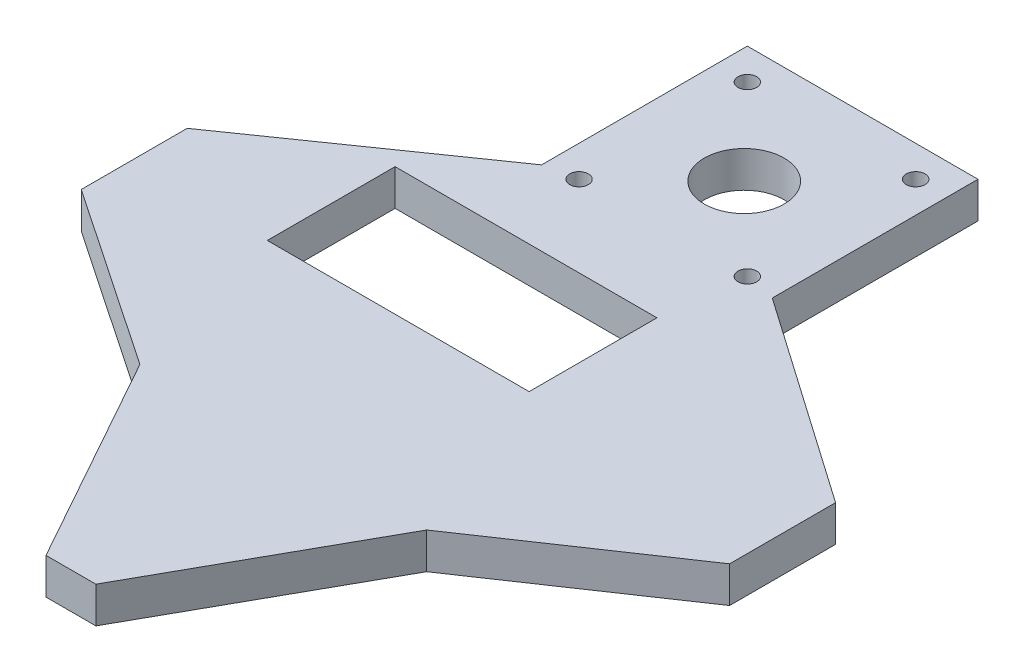
ISO-10303-21;
HEADER;
FILE_DESCRIPTION(('STEP AP214'),'2;1');
FILE_NAME('part.step','',(''),(''),'','','');
FILE_SCHEMA(('AUTOMOTIVE_DESIGN { 1 0 10303 214 1 1 1 1 }'));
ENDSEC;
DATA;
#1=APPLICATION_CONTEXT('core data for automotive mechanical design processes');
#2=APPLICATION_PROTOCOL_DEFINITION('international standard','automotive_design',2000,#1);
#3=PRODUCT_CONTEXT('',#1,'mechanical');
#4=PRODUCT('Part','Part','',(#3));
#5=PRODUCT_RELATED_PRODUCT_CATEGORY('part','',(#4));
#6=PRODUCT_DEFINITION_FORMATION('','',#4);
#7=PRODUCT_DEFINITION_CONTEXT('part definition',#1,'design');
#8=PRODUCT_DEFINITION('design','',#6,#7);
#9=PRODUCT_DEFINITION_SHAPE('','',#8);
#10=(LENGTH_UNIT() NAMED_UNIT(*) SI_UNIT(.MILLI.,.METRE.));
#11=(NAMED_UNIT(*) PLANE_ANGLE_UNIT() SI_UNIT($,.RADIAN.));
#12=(NAMED_UNIT(*) SI_UNIT($,.STERADIAN.) SOLID_ANGLE_UNIT());
#13=UNCERTAINTY_MEASURE_WITH_UNIT(LENGTH_MEASURE(1.E-05),#10,'distance_accuracy_value','');
#14=(GEOMETRIC_REPRESENTATION_CONTEXT(3) GLOBAL_UNCERTAINTY_ASSIGNED_CONTEXT((#13)) GLOBAL_UNIT_ASSIGNED_CONTEXT((#10,
#11,#12)) REPRESENTATION_CONTEXT('',''));
#15=CARTESIAN_POINT('',(0.,0.,0.));
#16=DIRECTION('',(0.,0.,1.));
#17=DIRECTION('',(1.,0.,0.));
#18=AXIS2_PLACEMENT_3D('',#15,#16,#17);
#19=CARTESIAN_POINT('',(0.,5.8,0.));
#20=DIRECTION('',(0.,0.,1.));
#21=DIRECTION('',(1.,0.,0.));
#22=AXIS2_PLACEMENT_3D('',#19,#20,#21);
#23=PLANE('',#22);
#24=DIRECTION('',(-1.,0.,0.));
#25=VECTOR('',#24,1.);
#26=CARTESIAN_POINT('',(0.,0.,0.));
#27=LINE('',#26,#25);
#28=CARTESIAN_POINT('',(18.5,0.,0.));
#29=VERTEX_POINT('',#28);
#30=CARTESIAN_POINT('',(-18.5,0.,0.));
#31=VERTEX_POINT('',#30);
#32=EDGE_CURVE('E276',#29,#31,#27,.T.);
#33=ORIENTED_EDGE('',*,*,#32,.T.);
#34=DIRECTION('',(0.,-1.,0.));
#35=VECTOR('',#34,1.);
#36=CARTESIAN_POINT('',(-18.5,5.8,0.));
#37=LINE('',#36,#35);
#38=CARTESIAN_POINT('',(-18.5,5.8,0.));
#39=VERTEX_POINT('',#38);
#40=EDGE_CURVE('E11',#39,#31,#37,.T.);
#41=ORIENTED_EDGE('',*,*,#40,.F.);
#42=DIRECTION('',(-1.,0.,0.));
#43=VECTOR('',#42,1.);
#44=CARTESIAN_POINT('',(0.,5.8,0.));
#45=LINE('',#44,#43);
#46=CARTESIAN_POINT('',(18.5,5.8,0.));
#47=VERTEX_POINT('',#46);
#48=EDGE_CURVE('E291',#47,#39,#45,.T.);
#49=ORIENTED_EDGE('',*,*,#48,.F.);
#50=DIRECTION('',(0.,-1.,0.));
#51=VECTOR('',#50,1.);
#52=CARTESIAN_POINT('',(18.5,5.8,0.));
#53=LINE('',#52,#51);
#54=EDGE_CURVE('E228',#47,#29,#53,.T.);
#55=ORIENTED_EDGE('',*,*,#54,.T.);
#56=EDGE_LOOP('',(#33,#41,#49,#55));
#57=FACE_BOUND('',#56,.T.);
#58=ADVANCED_FACE('F38',(#57),#23,.F.);
#59=CARTESIAN_POINT('',(-18.5,5.8,0.));
#60=DIRECTION('',(1.,0.,0.));
#61=DIRECTION('',(0.,0.,-1.));
#62=AXIS2_PLACEMENT_3D('',#59,#60,#61);
#63=PLANE('',#62);
#64=DIRECTION('',(0.,0.,1.));
#65=VECTOR('',#64,1.);
#66=CARTESIAN_POINT('',(-18.5,0.,0.));
#67=LINE('',#66,#65);
#68=CARTESIAN_POINT('',(-18.5,0.,33.));
#69=VERTEX_POINT('',#68);
#70=EDGE_CURVE('E316',#31,#69,#67,.T.);
#71=ORIENTED_EDGE('',*,*,#70,.T.);
#72=DIRECTION('',(0.,-1.,0.));
#73=VECTOR('',#72,1.);
#74=CARTESIAN_POINT('',(-18.5,5.8,33.));
#75=LINE('',#74,#73);
#76=CARTESIAN_POINT('',(-18.5,5.8,33.));
#77=VERTEX_POINT('',#76);
#78=EDGE_CURVE('E46',#77,#69,#75,.T.);
#79=ORIENTED_EDGE('',*,*,#78,.F.);
#80=DIRECTION('',(0.,0.,1.));
#81=VECTOR('',#80,1.);
#82=CARTESIAN_POINT('',(-18.5,5.8,0.));
#83=LINE('',#82,#81);
#84=EDGE_CURVE('E294',#39,#77,#83,.T.);
#85=ORIENTED_EDGE('',*,*,#84,.F.);
#86=ORIENTED_EDGE('',*,*,#40,.T.);
#87=EDGE_LOOP('',(#71,#79,#85,#86));
#88=FACE_BOUND('',#87,.T.);
#89=ADVANCED_FACE('F378',(#88),#63,.F.);
#90=CARTESIAN_POINT('',(-18.5,5.8,33.));
#91=DIRECTION('',(0.571740316904142,0.,0.820434647017269));
#92=DIRECTION('',(0.820434647017269,0.,-0.571740316904142));
#93=AXIS2_PLACEMENT_3D('',#90,#91,#92);
#94=PLANE('',#93);
#95=DIRECTION('',(-0.820434647017269,0.,0.571740316904142));
#96=VECTOR('',#95,1.);
#97=CARTESIAN_POINT('',(-18.5,0.,33.));
#98=LINE('',#97,#96);
#99=CARTESIAN_POINT('',(-52.,0.,56.3453093258818));
#100=VERTEX_POINT('',#99);
#101=EDGE_CURVE('E319',#69,#100,#98,.T.);
#102=ORIENTED_EDGE('',*,*,#101,.T.);
#103=DIRECTION('',(0.,-1.,0.));
#104=VECTOR('',#103,1.);
#105=CARTESIAN_POINT('',(-52.,5.8,56.3453093258818));
#106=LINE('',#105,#104);
#107=CARTESIAN_POINT('',(-52.,5.8,56.3453093258818));
#108=VERTEX_POINT('',#107);
#109=EDGE_CURVE('E344',#108,#100,#106,.T.);
#110=ORIENTED_EDGE('',*,*,#109,.F.);
#111=DIRECTION('',(-0.820434647017269,0.,0.571740316904142));
#112=VECTOR('',#111,1.);
#113=CARTESIAN_POINT('',(-18.5,5.8,33.));
#114=LINE('',#113,#112);
#115=EDGE_CURVE('E298',#77,#108,#114,.T.);
#116=ORIENTED_EDGE('',*,*,#115,.F.);
#117=ORIENTED_EDGE('',*,*,#78,.T.);
#118=EDGE_LOOP('',(#102,#110,#116,#117));
#119=FACE_BOUND('',#118,.T.);
#120=ADVANCED_FACE('F353',(#119),#94,.F.);
#121=CARTESIAN_POINT('',(-52.,5.8,56.3453093258818));
#122=DIRECTION('',(1.,0.,0.));
#123=DIRECTION('',(0.,0.,-1.));
#124=AXIS2_PLACEMENT_3D('',#121,#122,#123);
#125=PLANE('',#124);
#126=DIRECTION('',(0.,0.,1.));
#127=VECTOR('',#126,1.);
#128=CARTESIAN_POINT('',(-52.,0.,56.3453093258818));
#129=LINE('',#128,#127);
#130=CARTESIAN_POINT('',(-52.,0.,73.3453093258818));
#131=VERTEX_POINT('',#130);
#132=EDGE_CURVE('E322',#100,#131,#129,.T.);
#133=ORIENTED_EDGE('',*,*,#132,.T.);
#134=DIRECTION('',(0.,-1.,0.));
#135=VECTOR('',#134,1.);
#136=CARTESIAN_POINT('',(-52.,5.8,73.3453093258818));
#137=LINE('',#136,#135);
#138=CARTESIAN_POINT('',(-52.,5.8,73.3453093258818));
#139=VERTEX_POINT('',#138);
#140=EDGE_CURVE('E340',#139,#131,#137,.T.);
#141=ORIENTED_EDGE('',*,*,#140,.F.);
#142=DIRECTION('',(0.,0.,1.));
#143=VECTOR('',#142,1.);
#144=CARTESIAN_POINT('',(-52.,5.8,56.3453093258818));
#145=LINE('',#144,#143);
#146=EDGE_CURVE('E301',#108,#139,#145,.T.);
#147=ORIENTED_EDGE('',*,*,#146,.F.);
#148=ORIENTED_EDGE('',*,*,#109,.T.);
#149=EDGE_LOOP('',(#133,#141,#147,#148));
#150=FACE_BOUND('',#149,.T.);
#151=ADVANCED_FACE('F366',(#150),#125,.F.);
#152=CARTESIAN_POINT('',(-52.,5.8,73.3453093258818));
#153=DIRECTION('',(0.559883369779012,0.,-0.828571428571428));
#154=DIRECTION('',(-0.828571428571428,0.,-0.559883369779012));
#155=AXIS2_PLACEMENT_3D('',#152,#153,#154);
#156=PLANE('',#155);
#157=DIRECTION('',(0.828571428571429,0.,0.559883369779012));
#158=VECTOR('',#157,1.);
#159=CARTESIAN_POINT('',(-52.,0.,73.3453093258818));
#160=LINE('',#159,#158);
#161=CARTESIAN_POINT('',(-23.,0.,92.9412272681472));
#162=VERTEX_POINT('',#161);
#163=EDGE_CURVE('E325',#131,#162,#160,.T.);
#164=ORIENTED_EDGE('',*,*,#163,.T.);
#165=DIRECTION('',(0.,-1.,0.));
#166=VECTOR('',#165,1.);
#167=CARTESIAN_POINT('',(-23.,5.8,92.9412272681472));
#168=LINE('',#167,#166);
#169=CARTESIAN_POINT('',(-23.,5.8,92.9412272681472));
#170=VERTEX_POINT('',#169);
#171=EDGE_CURVE('E336',#170,#162,#168,.T.);
#172=ORIENTED_EDGE('',*,*,#171,.F.);
#173=DIRECTION('',(0.828571428571429,0.,0.559883369779012));
#174=VECTOR('',#173,1.);
#175=CARTESIAN_POINT('',(-52.,5.8,73.3453093258818));
#176=LINE('',#175,#174);
#177=EDGE_CURVE('E304',#139,#170,#176,.T.);
#178=ORIENTED_EDGE('',*,*,#177,.F.);
#179=ORIENTED_EDGE('',*,*,#140,.T.);
#180=EDGE_LOOP('',(#164,#172,#178,#179));
#181=FACE_BOUND('',#180,.T.);
#182=ADVANCED_FACE('F370',(#181),#156,.F.);
#183=CARTESIAN_POINT('',(-23.,5.8,92.9412272681472));
#184=DIRECTION('',(0.873301864919303,0.,-0.487179487179487));
#185=DIRECTION('',(-0.487179487179487,0.,-0.873301864919303));
#186=AXIS2_PLACEMENT_3D('',#183,#184,#185);
#187=PLANE('',#186);
#188=DIRECTION('',(0.487179487179487,0.,0.873301864919303));
#189=VECTOR('',#188,1.);
#190=CARTESIAN_POINT('',(-23.,0.,92.9412272681472));
#191=LINE('',#190,#189);
#192=CARTESIAN_POINT('',(-3.99999999999999,0.,127.));
#193=VERTEX_POINT('',#192);
#194=EDGE_CURVE('E328',#162,#193,#191,.T.);
#195=ORIENTED_EDGE('',*,*,#194,.T.);
#196=DIRECTION('',(0.,-1.,0.));
#197=VECTOR('',#196,1.);
#198=CARTESIAN_POINT('',(-3.99999999999999,5.8,127.));
#199=LINE('',#198,#197);
#200=CARTESIAN_POINT('',(-3.99999999999999,5.8,127.));
#201=VERTEX_POINT('',#200);
#202=EDGE_CURVE('E313',#201,#193,#199,.T.);
#203=ORIENTED_EDGE('',*,*,#202,.F.);
#204=DIRECTION('',(0.487179487179487,0.,0.873301864919303));
#205=VECTOR('',#204,1.);
#206=CARTESIAN_POINT('',(-23.,5.8,92.9412272681472));
#207=LINE('',#206,#205);
#208=EDGE_CURVE('E307',#170,#201,#207,.T.);
#209=ORIENTED_EDGE('',*,*,#208,.F.);
#210=ORIENTED_EDGE('',*,*,#171,.T.);
#211=EDGE_LOOP('',(#195,#203,#209,#210));
#212=FACE_BOUND('',#211,.T.);
#213=ADVANCED_FACE('F406',(#212),#187,.F.);
#214=CARTESIAN_POINT('',(-3.99999999999999,5.8,127.));
#215=DIRECTION('',(0.,0.,-1.));
#216=DIRECTION('',(-1.,0.,0.));
#217=AXIS2_PLACEMENT_3D('',#214,#215,#216);
#218=PLANE('',#217);
#219=DIRECTION('',(1.,0.,0.));
#220=VECTOR('',#219,1.);
#221=CARTESIAN_POINT('',(-3.99999999999999,0.,127.));
#222=LINE('',#221,#220);
#223=CARTESIAN_POINT('',(3.99999999999999,0.,127.));
#224=VERTEX_POINT('',#223);
#225=EDGE_CURVE('E295',#193,#224,#222,.T.);
#226=ORIENTED_EDGE('',*,*,#225,.T.);
#227=DIRECTION('',(0.,-1.,0.));
#228=VECTOR('',#227,1.);
#229=CARTESIAN_POINT('',(3.99999999999999,5.8,127.));
#230=LINE('',#229,#228);
#231=CARTESIAN_POINT('',(3.99999999999999,5.8,127.));
#232=VERTEX_POINT('',#231);
#233=EDGE_CURVE('E262',#232,#224,#230,.T.);
#234=ORIENTED_EDGE('',*,*,#233,.F.);
#235=DIRECTION('',(1.,0.,0.));
#236=VECTOR('',#235,1.);
#237=CARTESIAN_POINT('',(-3.99999999999999,5.8,127.));
#238=LINE('',#237,#236);
#239=EDGE_CURVE('E310',#201,#232,#238,.T.);
#240=ORIENTED_EDGE('',*,*,#239,.F.);
#241=ORIENTED_EDGE('',*,*,#202,.T.);
#242=EDGE_LOOP('',(#226,#234,#240,#241));
#243=FACE_BOUND('',#242,.T.);
#244=ADVANCED_FACE('F404',(#243),#218,.F.);
#245=CARTESIAN_POINT('',(0.,5.8,0.));
#246=DIRECTION('',(0.,1.,0.));
#247=DIRECTION('',(0.,0.,1.));
#248=AXIS2_PLACEMENT_3D('',#245,#246,#247);
#249=PLANE('',#248);
#250=DIRECTION('',(0.,0.,1.));
#251=VECTOR('',#250,1.);
#252=CARTESIAN_POINT('',(-30.,5.8,45.));
#253=LINE('',#252,#251);
#254=CARTESIAN_POINT('',(-30.,5.8,45.));
#255=VERTEX_POINT('',#254);
#256=CARTESIAN_POINT('',(-30.,5.8,65.5));
#257=VERTEX_POINT('',#256);
#258=EDGE_CURVE('E53',#255,#257,#253,.T.);
#259=ORIENTED_EDGE('',*,*,#258,.F.);
#260=DIRECTION('',(-1.,0.,0.));
#261=VECTOR('',#260,1.);
#262=CARTESIAN_POINT('',(-30.,5.8,45.));
#263=LINE('',#262,#261);
#264=CARTESIAN_POINT('',(12.,5.8,45.));
#265=VERTEX_POINT('',#264);
#266=EDGE_CURVE('E172',#265,#255,#263,.T.);
#267=ORIENTED_EDGE('',*,*,#266,.F.);
#268=DIRECTION('',(0.,0.,-1.));
#269=VECTOR('',#268,1.);
#270=CARTESIAN_POINT('',(12.,5.8,45.));
#271=LINE('',#270,#269);
#272=CARTESIAN_POINT('',(12.,5.8,65.5));
#273=VERTEX_POINT('',#272);
#274=EDGE_CURVE('E154',#273,#265,#271,.T.);
#275=ORIENTED_EDGE('',*,*,#274,.F.);
#276=DIRECTION('',(1.,0.,0.));
#277=VECTOR('',#276,1.);
#278=CARTESIAN_POINT('',(-30.,5.8,65.5));
#279=LINE('',#278,#277);
#280=EDGE_CURVE('E164',#257,#273,#279,.T.);
#281=ORIENTED_EDGE('',*,*,#280,.F.);
#282=EDGE_LOOP('',(#259,#267,#275,#281));
#283=FACE_BOUND('',#282,.T.);
#284=CARTESIAN_POINT('',(13.5,5.8,5.));
#285=DIRECTION('',(0.,-1.,0.));
#286=DIRECTION('',(0.,0.,1.));
#287=AXIS2_PLACEMENT_3D('',#284,#285,#286);
#288=CIRCLE('',#287,1.5);
#289=CARTESIAN_POINT('',(13.5,5.8,6.5));
#290=VERTEX_POINT('',#289);
#291=EDGE_CURVE('E191',#290,#290,#288,.T.);
#292=ORIENTED_EDGE('',*,*,#291,.T.);
#293=EDGE_LOOP('',(#292));
#294=FACE_BOUND('',#293,.T.);
#295=CARTESIAN_POINT('',(13.5,5.8,32.));
#296=DIRECTION('',(0.,-1.,0.));
#297=DIRECTION('',(0.,0.,1.));
#298=AXIS2_PLACEMENT_3D('',#295,#296,#297);
#299=CIRCLE('',#298,1.5);
#300=CARTESIAN_POINT('',(13.5,5.8,33.5));
#301=VERTEX_POINT('',#300);
#302=EDGE_CURVE('E189',#301,#301,#299,.T.);
#303=ORIENTED_EDGE('',*,*,#302,.T.);
#304=EDGE_LOOP('',(#303));
#305=FACE_BOUND('',#304,.T.);
#306=DIRECTION('',(0.,0.,1.));
#307=VECTOR('',#306,1.);
#308=CARTESIAN_POINT('',(18.5,5.8,0.));
#309=LINE('',#308,#307);
#310=CARTESIAN_POINT('',(18.5,5.8,33.));
#311=VERTEX_POINT('',#310);
#312=EDGE_CURVE('E224',#47,#311,#309,.T.);
#313=ORIENTED_EDGE('',*,*,#312,.F.);
#314=ORIENTED_EDGE('',*,*,#48,.T.);
#315=ORIENTED_EDGE('',*,*,#84,.T.);
#316=ORIENTED_EDGE('',*,*,#115,.T.);
#317=ORIENTED_EDGE('',*,*,#146,.T.);
#318=ORIENTED_EDGE('',*,*,#177,.T.);
#319=ORIENTED_EDGE('',*,*,#208,.T.);
#320=ORIENTED_EDGE('',*,*,#239,.T.);
#321=DIRECTION('',(-0.487179487179487,0.,0.873301864919303));
#322=VECTOR('',#321,1.);
#323=CARTESIAN_POINT('',(23.,5.8,92.9412272681472));
#324=LINE('',#323,#322);
#325=CARTESIAN_POINT('',(23.,5.8,92.9412272681472));
#326=VERTEX_POINT('',#325);
#327=EDGE_CURVE('E207',#326,#232,#324,.T.);
#328=ORIENTED_EDGE('',*,*,#327,.F.);
#329=DIRECTION('',(-0.828571428571429,0.,0.559883369779012));
#330=VECTOR('',#329,1.);
#331=CARTESIAN_POINT('',(52.,5.8,73.3453093258818));
#332=LINE('',#331,#330);
#333=CARTESIAN_POINT('',(52.,5.8,73.3453093258818));
#334=VERTEX_POINT('',#333);
#335=EDGE_CURVE('E211',#334,#326,#332,.T.);
#336=ORIENTED_EDGE('',*,*,#335,.F.);
#337=DIRECTION('',(0.,0.,1.));
#338=VECTOR('',#337,1.);
#339=CARTESIAN_POINT('',(52.,5.8,56.3453093258818));
#340=LINE('',#339,#338);
#341=CARTESIAN_POINT('',(52.,5.8,56.3453093258818));
#342=VERTEX_POINT('',#341);
#343=EDGE_CURVE('E216',#342,#334,#340,.T.);
#344=ORIENTED_EDGE('',*,*,#343,.F.);
#345=DIRECTION('',(0.820434647017269,0.,0.571740316904142));
#346=VECTOR('',#345,1.);
#347=CARTESIAN_POINT('',(18.5,5.8,33.));
#348=LINE('',#347,#346);
#349=EDGE_CURVE('E220',#311,#342,#348,.T.);
#350=ORIENTED_EDGE('',*,*,#349,.F.);
#351=EDGE_LOOP('',(#313,#314,#315,#316,#317,#318,#319,#320,#328,#336,#344,#350));
#352=FACE_BOUND('',#351,.T.);
#353=CARTESIAN_POINT('',(-13.5,5.8,5.));
#354=DIRECTION('',(0.,1.,0.));
#355=DIRECTION('',(0.,0.,1.));
#356=AXIS2_PLACEMENT_3D('',#353,#354,#355);
#357=CIRCLE('',#356,1.5);
#358=CARTESIAN_POINT('',(-13.5,5.8,6.5));
#359=VERTEX_POINT('',#358);
#360=EDGE_CURVE('E267',#359,#359,#357,.T.);
#361=ORIENTED_EDGE('',*,*,#360,.F.);
#362=EDGE_LOOP('',(#361));
#363=FACE_BOUND('',#362,.T.);
#364=CARTESIAN_POINT('',(0.,5.8,19.));
#365=DIRECTION('',(0.,1.,0.));
#366=DIRECTION('',(0.,0.,1.));
#367=AXIS2_PLACEMENT_3D('',#364,#365,#366);
#368=CIRCLE('',#367,6.4);
#369=CARTESIAN_POINT('',(0.,5.8,25.4));
#370=VERTEX_POINT('',#369);
#371=EDGE_CURVE('E277',#370,#370,#368,.T.);
#372=ORIENTED_EDGE('',*,*,#371,.F.);
#373=EDGE_LOOP('',(#372));
#374=FACE_BOUND('',#373,.T.);
#375=CARTESIAN_POINT('',(-13.5,5.8,32.));
#376=DIRECTION('',(0.,1.,0.));
#377=DIRECTION('',(0.,0.,1.));
#378=AXIS2_PLACEMENT_3D('',#375,#376,#377);
#379=CIRCLE('',#378,1.5);
#380=CARTESIAN_POINT('',(-13.5,5.8,33.5));
#381=VERTEX_POINT('',#380);
#382=EDGE_CURVE('E266',#381,#381,#379,.T.);
#383=ORIENTED_EDGE('',*,*,#382,.F.);
#384=EDGE_LOOP('',(#383));
#385=FACE_BOUND('',#384,.T.);
#386=ADVANCED_FACE('F169',(#283,#294,#305,#352,#363,#374,#385),#249,.T.);
#387=CARTESIAN_POINT('',(0.,0.,0.));
#388=DIRECTION('',(0.,1.,0.));
#389=DIRECTION('',(0.,0.,1.));
#390=AXIS2_PLACEMENT_3D('',#387,#388,#389);
#391=PLANE('',#390);
#392=DIRECTION('',(1.,0.,0.));
#393=VECTOR('',#392,1.);
#394=CARTESIAN_POINT('',(-30.,0.,45.));
#395=LINE('',#394,#393);
#396=CARTESIAN_POINT('',(-30.,0.,45.));
#397=VERTEX_POINT('',#396);
#398=CARTESIAN_POINT('',(12.,0.,45.));
#399=VERTEX_POINT('',#398);
#400=EDGE_CURVE('E595',#397,#399,#395,.T.);
#401=ORIENTED_EDGE('',*,*,#400,.F.);
#402=DIRECTION('',(0.,0.,-1.));
#403=VECTOR('',#402,1.);
#404=CARTESIAN_POINT('',(-30.,0.,45.));
#405=LINE('',#404,#403);
#406=CARTESIAN_POINT('',(-30.,0.,65.5));
#407=VERTEX_POINT('',#406);
#408=EDGE_CURVE('E190',#407,#397,#405,.T.);
#409=ORIENTED_EDGE('',*,*,#408,.F.);
#410=DIRECTION('',(-1.,0.,0.));
#411=VECTOR('',#410,1.);
#412=CARTESIAN_POINT('',(-30.,0.,65.5));
#413=LINE('',#412,#411);
#414=CARTESIAN_POINT('',(12.,0.,65.5));
#415=VERTEX_POINT('',#414);
#416=EDGE_CURVE('E186',#415,#407,#413,.T.);
#417=ORIENTED_EDGE('',*,*,#416,.F.);
#418=DIRECTION('',(0.,0.,1.));
#419=VECTOR('',#418,1.);
#420=CARTESIAN_POINT('',(12.,0.,45.));
#421=LINE('',#420,#419);
#422=EDGE_CURVE('E157',#399,#415,#421,.T.);
#423=ORIENTED_EDGE('',*,*,#422,.F.);
#424=EDGE_LOOP('',(#401,#409,#417,#423));
#425=FACE_BOUND('',#424,.T.);
#426=CARTESIAN_POINT('',(13.5,0.,5.));
#427=DIRECTION('',(0.,1.,0.));
#428=DIRECTION('',(0.,0.,1.));
#429=AXIS2_PLACEMENT_3D('',#426,#427,#428);
#430=CIRCLE('',#429,1.5);
#431=CARTESIAN_POINT('',(13.5,0.,6.5));
#432=VERTEX_POINT('',#431);
#433=EDGE_CURVE('E195',#432,#432,#430,.T.);
#434=ORIENTED_EDGE('',*,*,#433,.T.);
#435=EDGE_LOOP('',(#434));
#436=FACE_BOUND('',#435,.T.);
#437=CARTESIAN_POINT('',(0.,0.,19.));
#438=DIRECTION('',(0.,1.,0.));
#439=DIRECTION('',(0.,0.,1.));
#440=AXIS2_PLACEMENT_3D('',#437,#438,#439);
#441=CIRCLE('',#440,6.4);
#442=CARTESIAN_POINT('',(0.,0.,25.4));
#443=VERTEX_POINT('',#442);
#444=EDGE_CURVE('E272',#443,#443,#441,.F.);
#445=ORIENTED_EDGE('',*,*,#444,.F.);
#446=EDGE_LOOP('',(#445));
#447=FACE_BOUND('',#446,.T.);
#448=CARTESIAN_POINT('',(13.5,0.,32.));
#449=DIRECTION('',(0.,1.,0.));
#450=DIRECTION('',(0.,0.,1.));
#451=AXIS2_PLACEMENT_3D('',#448,#449,#450);
#452=CIRCLE('',#451,1.5);
#453=CARTESIAN_POINT('',(13.5,0.,33.5));
#454=VERTEX_POINT('',#453);
#455=EDGE_CURVE('E196',#454,#454,#452,.T.);
#456=ORIENTED_EDGE('',*,*,#455,.T.);
#457=EDGE_LOOP('',(#456));
#458=FACE_BOUND('',#457,.T.);
#459=ORIENTED_EDGE('',*,*,#32,.F.);
#460=DIRECTION('',(0.,0.,1.));
#461=VECTOR('',#460,1.);
#462=CARTESIAN_POINT('',(18.5,0.,0.));
#463=LINE('',#462,#461);
#464=CARTESIAN_POINT('',(18.5,0.,33.));
#465=VERTEX_POINT('',#464);
#466=EDGE_CURVE('E212',#29,#465,#463,.T.);
#467=ORIENTED_EDGE('',*,*,#466,.T.);
#468=DIRECTION('',(0.820434647017269,0.,0.571740316904142));
#469=VECTOR('',#468,1.);
#470=CARTESIAN_POINT('',(18.5,0.,33.));
#471=LINE('',#470,#469);
#472=CARTESIAN_POINT('',(52.,0.,56.3453093258818));
#473=VERTEX_POINT('',#472);
#474=EDGE_CURVE('E240',#465,#473,#471,.T.);
#475=ORIENTED_EDGE('',*,*,#474,.T.);
#476=DIRECTION('',(0.,0.,1.));
#477=VECTOR('',#476,1.);
#478=CARTESIAN_POINT('',(52.,0.,56.3453093258818));
#479=LINE('',#478,#477);
#480=CARTESIAN_POINT('',(52.,0.,73.3453093258818));
#481=VERTEX_POINT('',#480);
#482=EDGE_CURVE('E236',#473,#481,#479,.T.);
#483=ORIENTED_EDGE('',*,*,#482,.T.);
#484=DIRECTION('',(-0.828571428571429,0.,0.559883369779012));
#485=VECTOR('',#484,1.);
#486=CARTESIAN_POINT('',(52.,0.,73.3453093258818));
#487=LINE('',#486,#485);
#488=CARTESIAN_POINT('',(23.,0.,92.9412272681472));
#489=VERTEX_POINT('',#488);
#490=EDGE_CURVE('E232',#481,#489,#487,.T.);
#491=ORIENTED_EDGE('',*,*,#490,.T.);
#492=DIRECTION('',(-0.487179487179487,0.,0.873301864919303));
#493=VECTOR('',#492,1.);
#494=CARTESIAN_POINT('',(23.,0.,92.9412272681472));
#495=LINE('',#494,#493);
#496=EDGE_CURVE('E200',#489,#224,#495,.T.);
#497=ORIENTED_EDGE('',*,*,#496,.T.);
#498=ORIENTED_EDGE('',*,*,#225,.F.);
#499=ORIENTED_EDGE('',*,*,#194,.F.);
#500=ORIENTED_EDGE('',*,*,#163,.F.);
#501=ORIENTED_EDGE('',*,*,#132,.F.);
#502=ORIENTED_EDGE('',*,*,#101,.F.);
#503=ORIENTED_EDGE('',*,*,#70,.F.);
#504=EDGE_LOOP('',(#459,#467,#475,#483,#491,#497,#498,#499,#500,#501,#502,#503));
#505=FACE_BOUND('',#504,.T.);
#506=CARTESIAN_POINT('',(-13.5,0.,5.));
#507=DIRECTION('',(0.,1.,0.));
#508=DIRECTION('',(0.,0.,1.));
#509=AXIS2_PLACEMENT_3D('',#506,#507,#508);
#510=CIRCLE('',#509,1.5);
#511=CARTESIAN_POINT('',(-13.5,0.,6.5));
#512=VERTEX_POINT('',#511);
#513=EDGE_CURVE('E271',#512,#512,#510,.F.);
#514=ORIENTED_EDGE('',*,*,#513,.F.);
#515=EDGE_LOOP('',(#514));
#516=FACE_BOUND('',#515,.T.);
#517=CARTESIAN_POINT('',(-13.5,0.,32.));
#518=DIRECTION('',(0.,1.,0.));
#519=DIRECTION('',(0.,0.,1.));
#520=AXIS2_PLACEMENT_3D('',#517,#518,#519);
#521=CIRCLE('',#520,1.5);
#522=CARTESIAN_POINT('',(-13.5,0.,33.5));
#523=VERTEX_POINT('',#522);
#524=EDGE_CURVE('E281',#523,#523,#521,.F.);
#525=ORIENTED_EDGE('',*,*,#524,.F.);
#526=EDGE_LOOP('',(#525));
#527=FACE_BOUND('',#526,.T.);
#528=ADVANCED_FACE('F360',(#425,#436,#447,#458,#505,#516,#527),#391,.F.);
#529=CARTESIAN_POINT('',(-13.5,-18.1019335983756,32.));
#530=DIRECTION('',(0.,1.,0.));
#531=DIRECTION('',(0.,0.,1.));
#532=AXIS2_PLACEMENT_3D('',#529,#530,#531);
#533=CYLINDRICAL_SURFACE('',#532,1.5);
#534=ORIENTED_EDGE('',*,*,#524,.T.);
#535=EDGE_LOOP('',(#534));
#536=FACE_BOUND('',#535,.T.);
#537=ORIENTED_EDGE('',*,*,#382,.T.);
#538=EDGE_LOOP('',(#537));
#539=FACE_BOUND('',#538,.T.);
#540=ADVANCED_FACE('F443',(#536,#539),#533,.F.);
#541=CARTESIAN_POINT('',(0.,-18.1019335983756,19.));
#542=DIRECTION('',(0.,1.,0.));
#543=DIRECTION('',(0.,0.,1.));
#544=AXIS2_PLACEMENT_3D('',#541,#542,#543);
#545=CYLINDRICAL_SURFACE('',#544,6.4);
#546=ORIENTED_EDGE('',*,*,#371,.T.);
#547=EDGE_LOOP('',(#546));
#548=FACE_BOUND('',#547,.T.);
#549=ORIENTED_EDGE('',*,*,#444,.T.);
#550=EDGE_LOOP('',(#549));
#551=FACE_BOUND('',#550,.T.);
#552=ADVANCED_FACE('F448',(#548,#551),#545,.F.);
#553=CARTESIAN_POINT('',(-13.5,-18.1019335983756,5.));
#554=DIRECTION('',(0.,1.,0.));
#555=DIRECTION('',(0.,0.,1.));
#556=AXIS2_PLACEMENT_3D('',#553,#554,#555);
#557=CYLINDRICAL_SURFACE('',#556,1.5);
#558=ORIENTED_EDGE('',*,*,#513,.T.);
#559=EDGE_LOOP('',(#558));
#560=FACE_BOUND('',#559,.T.);
#561=ORIENTED_EDGE('',*,*,#360,.T.);
#562=EDGE_LOOP('',(#561));
#563=FACE_BOUND('',#562,.T.);
#564=ADVANCED_FACE('F458',(#560,#563),#557,.F.);
#565=CARTESIAN_POINT('',(23.,5.8,92.9412272681472));
#566=DIRECTION('',(0.873301864919303,0.,0.487179487179487));
#567=DIRECTION('',(0.487179487179487,0.,-0.873301864919303));
#568=AXIS2_PLACEMENT_3D('',#565,#566,#567);
#569=PLANE('',#568);
#570=ORIENTED_EDGE('',*,*,#496,.F.);
#571=DIRECTION('',(0.,-1.,0.));
#572=VECTOR('',#571,1.);
#573=CARTESIAN_POINT('',(23.,5.8,92.9412272681472));
#574=LINE('',#573,#572);
#575=EDGE_CURVE('E259',#326,#489,#574,.T.);
#576=ORIENTED_EDGE('',*,*,#575,.F.);
#577=ORIENTED_EDGE('',*,*,#327,.T.);
#578=ORIENTED_EDGE('',*,*,#233,.T.);
#579=EDGE_LOOP('',(#570,#576,#577,#578));
#580=FACE_BOUND('',#579,.T.);
#581=ADVANCED_FACE('F400',(#580),#569,.T.);
#582=CARTESIAN_POINT('',(52.,5.8,73.3453093258818));
#583=DIRECTION('',(0.559883369779012,0.,0.828571428571428));
#584=DIRECTION('',(0.828571428571428,0.,-0.559883369779012));
#585=AXIS2_PLACEMENT_3D('',#582,#583,#584);
#586=PLANE('',#585);
#587=ORIENTED_EDGE('',*,*,#490,.F.);
#588=DIRECTION('',(0.,-1.,0.));
#589=VECTOR('',#588,1.);
#590=CARTESIAN_POINT('',(52.,5.8,73.3453093258818));
#591=LINE('',#590,#589);
#592=EDGE_CURVE('E256',#334,#481,#591,.T.);
#593=ORIENTED_EDGE('',*,*,#592,.F.);
#594=ORIENTED_EDGE('',*,*,#335,.T.);
#595=ORIENTED_EDGE('',*,*,#575,.T.);
#596=EDGE_LOOP('',(#587,#593,#594,#595));
#597=FACE_BOUND('',#596,.T.);
#598=ADVANCED_FACE('F396',(#597),#586,.T.);
#599=CARTESIAN_POINT('',(52.,5.8,56.3453093258818));
#600=DIRECTION('',(1.,0.,0.));
#601=DIRECTION('',(0.,0.,-1.));
#602=AXIS2_PLACEMENT_3D('',#599,#600,#601);
#603=PLANE('',#602);
#604=ORIENTED_EDGE('',*,*,#482,.F.);
#605=DIRECTION('',(0.,-1.,0.));
#606=VECTOR('',#605,1.);
#607=CARTESIAN_POINT('',(52.,5.8,56.3453093258818));
#608=LINE('',#607,#606);
#609=EDGE_CURVE('E253',#342,#473,#608,.T.);
#610=ORIENTED_EDGE('',*,*,#609,.F.);
#611=ORIENTED_EDGE('',*,*,#343,.T.);
#612=ORIENTED_EDGE('',*,*,#592,.T.);
#613=EDGE_LOOP('',(#604,#610,#611,#612));
#614=FACE_BOUND('',#613,.T.);
#615=ADVANCED_FACE('F391',(#614),#603,.T.);
#616=CARTESIAN_POINT('',(18.5,5.8,33.));
#617=DIRECTION('',(0.571740316904142,0.,-0.820434647017269));
#618=DIRECTION('',(-0.820434647017269,0.,-0.571740316904142));
#619=AXIS2_PLACEMENT_3D('',#616,#617,#618);
#620=PLANE('',#619);
#621=ORIENTED_EDGE('',*,*,#474,.F.);
#622=DIRECTION('',(0.,-1.,0.));
#623=VECTOR('',#622,1.);
#624=CARTESIAN_POINT('',(18.5,5.8,33.));
#625=LINE('',#624,#623);
#626=EDGE_CURVE('E250',#311,#465,#625,.T.);
#627=ORIENTED_EDGE('',*,*,#626,.F.);
#628=ORIENTED_EDGE('',*,*,#349,.T.);
#629=ORIENTED_EDGE('',*,*,#609,.T.);
#630=EDGE_LOOP('',(#621,#627,#628,#629));
#631=FACE_BOUND('',#630,.T.);
#632=ADVANCED_FACE('F387',(#631),#620,.T.);
#633=CARTESIAN_POINT('',(18.5,5.8,0.));
#634=DIRECTION('',(1.,0.,0.));
#635=DIRECTION('',(0.,0.,-1.));
#636=AXIS2_PLACEMENT_3D('',#633,#634,#635);
#637=PLANE('',#636);
#638=ORIENTED_EDGE('',*,*,#466,.F.);
#639=ORIENTED_EDGE('',*,*,#54,.F.);
#640=ORIENTED_EDGE('',*,*,#312,.T.);
#641=ORIENTED_EDGE('',*,*,#626,.T.);
#642=EDGE_LOOP('',(#638,#639,#640,#641));
#643=FACE_BOUND('',#642,.T.);
#644=ADVANCED_FACE('F384',(#643),#637,.T.);
#645=CARTESIAN_POINT('',(13.5,-18.1019335983756,32.));
#646=DIRECTION('',(0.,1.,0.));
#647=DIRECTION('',(0.,0.,1.));
#648=AXIS2_PLACEMENT_3D('',#645,#646,#647);
#649=CYLINDRICAL_SURFACE('',#648,1.5);
#650=ORIENTED_EDGE('',*,*,#455,.F.);
#651=EDGE_LOOP('',(#650));
#652=FACE_BOUND('',#651,.T.);
#653=ORIENTED_EDGE('',*,*,#302,.F.);
#654=EDGE_LOOP('',(#653));
#655=FACE_BOUND('',#654,.T.);
#656=ADVANCED_FACE('F527',(#652,#655),#649,.F.);
#657=CARTESIAN_POINT('',(13.5,-18.1019335983756,5.));
#658=DIRECTION('',(0.,1.,0.));
#659=DIRECTION('',(0.,0.,1.));
#660=AXIS2_PLACEMENT_3D('',#657,#658,#659);
#661=CYLINDRICAL_SURFACE('',#660,1.5);
#662=ORIENTED_EDGE('',*,*,#433,.F.);
#663=EDGE_LOOP('',(#662));
#664=FACE_BOUND('',#663,.T.);
#665=ORIENTED_EDGE('',*,*,#291,.F.);
#666=EDGE_LOOP('',(#665));
#667=FACE_BOUND('',#666,.T.);
#668=ADVANCED_FACE('F535',(#664,#667),#661,.F.);
#669=CARTESIAN_POINT('',(-30.,-46.7359604587303,45.));
#670=DIRECTION('',(-1.,0.,0.));
#671=DIRECTION('',(0.,0.,1.));
#672=AXIS2_PLACEMENT_3D('',#669,#670,#671);
#673=PLANE('',#672);
#674=ORIENTED_EDGE('',*,*,#408,.T.);
#675=DIRECTION('',(0.,1.,0.));
#676=VECTOR('',#675,1.);
#677=CARTESIAN_POINT('',(-30.,-46.7359604587303,45.));
#678=LINE('',#677,#676);
#679=EDGE_CURVE('E179',#397,#255,#678,.T.);
#680=ORIENTED_EDGE('',*,*,#679,.T.);
#681=ORIENTED_EDGE('',*,*,#258,.T.);
#682=DIRECTION('',(0.,1.,0.));
#683=VECTOR('',#682,1.);
#684=CARTESIAN_POINT('',(-30.,-46.7359604587303,65.5));
#685=LINE('',#684,#683);
#686=EDGE_CURVE('E161',#407,#257,#685,.T.);
#687=ORIENTED_EDGE('',*,*,#686,.F.);
#688=EDGE_LOOP('',(#674,#680,#681,#687));
#689=FACE_BOUND('',#688,.T.);
#690=ADVANCED_FACE('F545',(#689),#673,.F.);
#691=CARTESIAN_POINT('',(-30.,-46.7359604587303,45.));
#692=DIRECTION('',(0.,0.,-1.));
#693=DIRECTION('',(-1.,0.,0.));
#694=AXIS2_PLACEMENT_3D('',#691,#692,#693);
#695=PLANE('',#694);
#696=ORIENTED_EDGE('',*,*,#400,.T.);
#697=DIRECTION('',(0.,1.,0.));
#698=VECTOR('',#697,1.);
#699=CARTESIAN_POINT('',(12.,-46.7359604587303,45.));
#700=LINE('',#699,#698);
#701=EDGE_CURVE('E160',#399,#265,#700,.T.);
#702=ORIENTED_EDGE('',*,*,#701,.T.);
#703=ORIENTED_EDGE('',*,*,#266,.T.);
#704=ORIENTED_EDGE('',*,*,#679,.F.);
#705=EDGE_LOOP('',(#696,#702,#703,#704));
#706=FACE_BOUND('',#705,.T.);
#707=ADVANCED_FACE('F564',(#706),#695,.F.);
#708=CARTESIAN_POINT('',(12.,-46.7359604587303,45.));
#709=DIRECTION('',(1.,0.,0.));
#710=DIRECTION('',(0.,0.,-1.));
#711=AXIS2_PLACEMENT_3D('',#708,#709,#710);
#712=PLANE('',#711);
#713=ORIENTED_EDGE('',*,*,#422,.T.);
#714=DIRECTION('',(0.,1.,0.));
#715=VECTOR('',#714,1.);
#716=CARTESIAN_POINT('',(12.,-46.7359604587303,65.5));
#717=LINE('',#716,#715);
#718=EDGE_CURVE('E61',#415,#273,#717,.T.);
#719=ORIENTED_EDGE('',*,*,#718,.T.);
#720=ORIENTED_EDGE('',*,*,#274,.T.);
#721=ORIENTED_EDGE('',*,*,#701,.F.);
#722=EDGE_LOOP('',(#713,#719,#720,#721));
#723=FACE_BOUND('',#722,.T.);
#724=ADVANCED_FACE('F151',(#723),#712,.F.);
#725=CARTESIAN_POINT('',(-30.,-46.7359604587303,65.5));
#726=DIRECTION('',(0.,0.,1.));
#727=DIRECTION('',(1.,0.,0.));
#728=AXIS2_PLACEMENT_3D('',#725,#726,#727);
#729=PLANE('',#728);
#730=ORIENTED_EDGE('',*,*,#416,.T.);
#731=ORIENTED_EDGE('',*,*,#686,.T.);
#732=ORIENTED_EDGE('',*,*,#280,.T.);
#733=ORIENTED_EDGE('',*,*,#718,.F.);
#734=EDGE_LOOP('',(#730,#731,#732,#733));
#735=FACE_BOUND('',#734,.T.);
#736=ADVANCED_FACE('F165',(#735),#729,.F.);
#737=CLOSED_SHELL('',(#58,#89,#120,#151,#182,#213,#244,#386,#528,#540,#552,#564,#581,#598,#615,
#632,#644,#656,#668,#690,#707,#724,#736));
#738=MANIFOLD_SOLID_BREP('B2',#737);
#739=ADVANCED_BREP_SHAPE_REPRESENTATION('',(#18,#738),#14);
#740=SHAPE_DEFINITION_REPRESENTATION(#9,#739);
ENDSEC;
END-ISO-10303-21;
